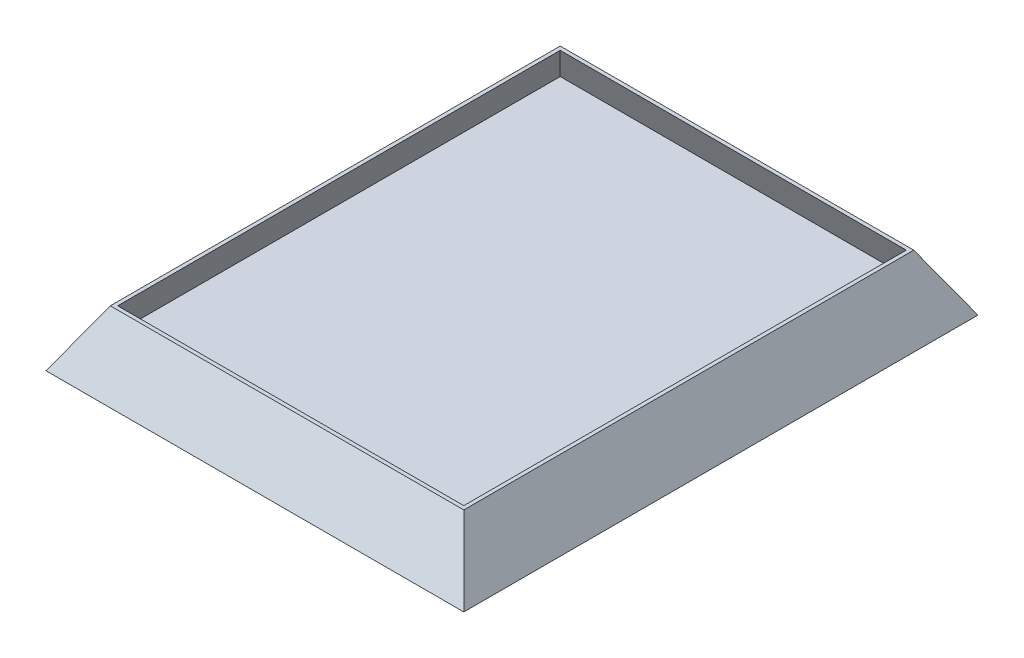
ISO-10303-21;
HEADER;
FILE_DESCRIPTION(('STEP AP214'),'2;1');
FILE_NAME('part.step','',(''),(''),'','','');
FILE_SCHEMA(('AUTOMOTIVE_DESIGN { 1 0 10303 214 1 1 1 1 }'));
ENDSEC;
DATA;
#1=APPLICATION_CONTEXT('core data for automotive mechanical design processes');
#2=APPLICATION_PROTOCOL_DEFINITION('international standard','automotive_design',2000,#1);
#3=PRODUCT_CONTEXT('',#1,'mechanical');
#4=PRODUCT('Part','Part','',(#3));
#5=PRODUCT_RELATED_PRODUCT_CATEGORY('part','',(#4));
#6=PRODUCT_DEFINITION_FORMATION('','',#4);
#7=PRODUCT_DEFINITION_CONTEXT('part definition',#1,'design');
#8=PRODUCT_DEFINITION('design','',#6,#7);
#9=PRODUCT_DEFINITION_SHAPE('','',#8);
#10=(LENGTH_UNIT() NAMED_UNIT(*) SI_UNIT(.MILLI.,.METRE.));
#11=(NAMED_UNIT(*) PLANE_ANGLE_UNIT() SI_UNIT($,.RADIAN.));
#12=(NAMED_UNIT(*) SI_UNIT($,.STERADIAN.) SOLID_ANGLE_UNIT());
#13=UNCERTAINTY_MEASURE_WITH_UNIT(LENGTH_MEASURE(1.E-05),#10,'distance_accuracy_value','');
#14=(GEOMETRIC_REPRESENTATION_CONTEXT(3) GLOBAL_UNCERTAINTY_ASSIGNED_CONTEXT((#13)) GLOBAL_UNIT_ASSIGNED_CONTEXT((#10,
#11,#12)) REPRESENTATION_CONTEXT('',''));
#15=CARTESIAN_POINT('',(0.,0.,0.));
#16=DIRECTION('',(0.,0.,1.));
#17=DIRECTION('',(1.,0.,0.));
#18=AXIS2_PLACEMENT_3D('',#15,#16,#17);
#19=CARTESIAN_POINT('',(0.,0.,0.));
#20=DIRECTION('',(0.,-1.,0.));
#21=DIRECTION('',(0.,0.,-1.));
#22=AXIS2_PLACEMENT_3D('',#19,#20,#21);
#23=PLANE('',#22);
#24=DIRECTION('',(0.,0.,-1.));
#25=VECTOR('',#24,1.);
#26=CARTESIAN_POINT('',(279.4,0.,355.6));
#27=LINE('',#26,#25);
#28=CARTESIAN_POINT('',(279.4,0.,355.6));
#29=VERTEX_POINT('',#28);
#30=CARTESIAN_POINT('',(279.4,0.,-355.6));
#31=VERTEX_POINT('',#30);
#32=EDGE_CURVE('E262',#29,#31,#27,.T.);
#33=ORIENTED_EDGE('',*,*,#32,.T.);
#34=DIRECTION('',(-1.,0.,0.));
#35=VECTOR('',#34,1.);
#36=CARTESIAN_POINT('',(-279.4,0.,-355.6));
#37=LINE('',#36,#35);
#38=CARTESIAN_POINT('',(-279.4,0.,-355.6));
#39=VERTEX_POINT('',#38);
#40=EDGE_CURVE('E296',#31,#39,#37,.T.);
#41=ORIENTED_EDGE('',*,*,#40,.T.);
#42=DIRECTION('',(0.,0.,1.));
#43=VECTOR('',#42,1.);
#44=CARTESIAN_POINT('',(-279.4,0.,355.6));
#45=LINE('',#44,#43);
#46=CARTESIAN_POINT('',(-279.4,0.,355.6));
#47=VERTEX_POINT('',#46);
#48=EDGE_CURVE('E60',#39,#47,#45,.T.);
#49=ORIENTED_EDGE('',*,*,#48,.T.);
#50=DIRECTION('',(1.,0.,0.));
#51=VECTOR('',#50,1.);
#52=CARTESIAN_POINT('',(-279.4,0.,355.6));
#53=LINE('',#52,#51);
#54=EDGE_CURVE('E12',#47,#29,#53,.T.);
#55=ORIENTED_EDGE('',*,*,#54,.T.);
#56=EDGE_LOOP('',(#33,#41,#49,#55));
#57=FACE_BOUND('',#56,.T.);
#58=DIRECTION('',(0.,0.,-1.));
#59=VECTOR('',#58,1.);
#60=CARTESIAN_POINT('',(273.549104376949,0.,0.));
#61=LINE('',#60,#59);
#62=CARTESIAN_POINT('',(273.549104376949,0.,349.749104376949));
#63=VERTEX_POINT('',#62);
#64=CARTESIAN_POINT('',(273.549104376949,0.,-349.749104376949));
#65=VERTEX_POINT('',#64);
#66=EDGE_CURVE('E143',#63,#65,#61,.T.);
#67=ORIENTED_EDGE('',*,*,#66,.F.);
#68=DIRECTION('',(1.,0.,0.));
#69=VECTOR('',#68,1.);
#70=CARTESIAN_POINT('',(0.,0.,349.749104376949));
#71=LINE('',#70,#69);
#72=CARTESIAN_POINT('',(-273.549104376949,0.,349.749104376949));
#73=VERTEX_POINT('',#72);
#74=EDGE_CURVE('E162',#73,#63,#71,.T.);
#75=ORIENTED_EDGE('',*,*,#74,.F.);
#76=DIRECTION('',(0.,0.,1.));
#77=VECTOR('',#76,1.);
#78=CARTESIAN_POINT('',(-273.549104376949,0.,0.));
#79=LINE('',#78,#77);
#80=CARTESIAN_POINT('',(-273.549104376949,0.,-349.749104376949));
#81=VERTEX_POINT('',#80);
#82=EDGE_CURVE('E68',#81,#73,#79,.T.);
#83=ORIENTED_EDGE('',*,*,#82,.F.);
#84=DIRECTION('',(-1.,0.,0.));
#85=VECTOR('',#84,1.);
#86=CARTESIAN_POINT('',(0.,0.,-349.749104376949));
#87=LINE('',#86,#85);
#88=EDGE_CURVE('E157',#65,#81,#87,.T.);
#89=ORIENTED_EDGE('',*,*,#88,.F.);
#90=EDGE_LOOP('',(#67,#75,#83,#89));
#91=FACE_BOUND('',#90,.T.);
#92=ADVANCED_FACE('F49',(#57,#91),#23,.F.);
#93=CARTESIAN_POINT('',(0.,-88.9,0.));
#94=DIRECTION('',(0.,-1.,0.));
#95=DIRECTION('',(0.,0.,-1.));
#96=AXIS2_PLACEMENT_3D('',#93,#94,#95);
#97=PLANE('',#96);
#98=DIRECTION('',(0.,0.,1.));
#99=VECTOR('',#98,1.);
#100=CARTESIAN_POINT('',(-330.2,-88.9,-406.4));
#101=LINE('',#100,#99);
#102=CARTESIAN_POINT('',(-330.2,-88.9,-406.4));
#103=VERTEX_POINT('',#102);
#104=CARTESIAN_POINT('',(-330.2,-88.9,406.4));
#105=VERTEX_POINT('',#104);
#106=EDGE_CURVE('E165',#103,#105,#101,.T.);
#107=ORIENTED_EDGE('',*,*,#106,.F.);
#108=DIRECTION('',(-1.,0.,0.));
#109=VECTOR('',#108,1.);
#110=CARTESIAN_POINT('',(330.2,-88.9,-406.4));
#111=LINE('',#110,#109);
#112=CARTESIAN_POINT('',(330.2,-88.9,-406.4));
#113=VERTEX_POINT('',#112);
#114=EDGE_CURVE('E173',#113,#103,#111,.T.);
#115=ORIENTED_EDGE('',*,*,#114,.F.);
#116=DIRECTION('',(0.,0.,-1.));
#117=VECTOR('',#116,1.);
#118=CARTESIAN_POINT('',(330.2,-88.9,-406.4));
#119=LINE('',#118,#117);
#120=CARTESIAN_POINT('',(330.2,-88.9,406.4));
#121=VERTEX_POINT('',#120);
#122=EDGE_CURVE('E269',#121,#113,#119,.T.);
#123=ORIENTED_EDGE('',*,*,#122,.F.);
#124=DIRECTION('',(1.,0.,0.));
#125=VECTOR('',#124,1.);
#126=CARTESIAN_POINT('',(330.2,-88.9,406.4));
#127=LINE('',#126,#125);
#128=EDGE_CURVE('E250',#105,#121,#127,.T.);
#129=ORIENTED_EDGE('',*,*,#128,.F.);
#130=EDGE_LOOP('',(#107,#115,#123,#129));
#131=FACE_BOUND('',#130,.T.);
#132=ADVANCED_FACE('F192',(#131),#97,.T.);
#133=CARTESIAN_POINT('',(0.,153.181538461538,-268.067692307692));
#134=DIRECTION('',(0.,-0.496138938356834,0.868243142124459));
#135=DIRECTION('',(0.,-0.868243142124459,-0.496138938356834));
#136=AXIS2_PLACEMENT_3D('',#133,#134,#135);
#137=PLANE('',#136);
#138=DIRECTION('',(0.444444444444447,0.777777777777777,0.444444444444444));
#139=VECTOR('',#138,1.);
#140=CARTESIAN_POINT('',(-330.2,-88.9,-406.4));
#141=LINE('',#140,#139);
#142=EDGE_CURVE('E432',#103,#39,#141,.T.);
#143=ORIENTED_EDGE('',*,*,#142,.T.);
#144=ORIENTED_EDGE('',*,*,#40,.F.);
#145=DIRECTION('',(-0.444444444444444,0.777777777777778,0.444444444444444));
#146=VECTOR('',#145,1.);
#147=CARTESIAN_POINT('',(330.2,-88.9,-406.4));
#148=LINE('',#147,#146);
#149=EDGE_CURVE('E179',#113,#31,#148,.T.);
#150=ORIENTED_EDGE('',*,*,#149,.F.);
#151=ORIENTED_EDGE('',*,*,#114,.T.);
#152=EDGE_LOOP('',(#143,#144,#150,#151));
#153=FACE_BOUND('',#152,.T.);
#154=ADVANCED_FACE('F181',(#153),#137,.F.);
#155=CARTESIAN_POINT('',(210.624615384615,120.356923076923,0.));
#156=DIRECTION('',(-0.868243142124459,-0.496138938356834,0.));
#157=DIRECTION('',(0.496138938356834,-0.868243142124459,0.));
#158=AXIS2_PLACEMENT_3D('',#155,#156,#157);
#159=PLANE('',#158);
#160=ORIENTED_EDGE('',*,*,#149,.T.);
#161=ORIENTED_EDGE('',*,*,#32,.F.);
#162=DIRECTION('',(-0.444444444444444,0.777777777777778,-0.444444444444444));
#163=VECTOR('',#162,1.);
#164=CARTESIAN_POINT('',(330.2,-88.9,406.4));
#165=LINE('',#164,#163);
#166=EDGE_CURVE('E242',#121,#29,#165,.T.);
#167=ORIENTED_EDGE('',*,*,#166,.F.);
#168=ORIENTED_EDGE('',*,*,#122,.T.);
#169=EDGE_LOOP('',(#160,#161,#167,#168));
#170=FACE_BOUND('',#169,.T.);
#171=ADVANCED_FACE('F191',(#170),#159,.F.);
#172=CARTESIAN_POINT('',(-210.624615384615,120.356923076923,0.));
#173=DIRECTION('',(0.868243142124458,-0.496138938356836,0.));
#174=DIRECTION('',(0.496138938356836,0.868243142124458,0.));
#175=AXIS2_PLACEMENT_3D('',#172,#173,#174);
#176=PLANE('',#175);
#177=DIRECTION('',(0.444444444444447,0.777777777777777,-0.444444444444444));
#178=VECTOR('',#177,1.);
#179=CARTESIAN_POINT('',(-330.2,-88.9,406.4));
#180=LINE('',#179,#178);
#181=EDGE_CURVE('E234',#105,#47,#180,.T.);
#182=ORIENTED_EDGE('',*,*,#181,.T.);
#183=ORIENTED_EDGE('',*,*,#48,.F.);
#184=ORIENTED_EDGE('',*,*,#142,.F.);
#185=ORIENTED_EDGE('',*,*,#106,.T.);
#186=EDGE_LOOP('',(#182,#183,#184,#185));
#187=FACE_BOUND('',#186,.T.);
#188=ADVANCED_FACE('F216',(#187),#176,.F.);
#189=CARTESIAN_POINT('',(0.,153.181538461538,268.067692307692));
#190=DIRECTION('',(0.,-0.496138938356834,-0.868243142124459));
#191=DIRECTION('',(0.,0.868243142124459,-0.496138938356834));
#192=AXIS2_PLACEMENT_3D('',#189,#190,#191);
#193=PLANE('',#192);
#194=ORIENTED_EDGE('',*,*,#166,.T.);
#195=ORIENTED_EDGE('',*,*,#54,.F.);
#196=ORIENTED_EDGE('',*,*,#181,.F.);
#197=ORIENTED_EDGE('',*,*,#128,.T.);
#198=EDGE_LOOP('',(#194,#195,#196,#197));
#199=FACE_BOUND('',#198,.T.);
#200=ADVANCED_FACE('F224',(#199),#193,.F.);
#201=CARTESIAN_POINT('',(0.,-83.82,0.));
#202=DIRECTION('',(0.,-1.,0.));
#203=DIRECTION('',(0.,0.,-1.));
#204=AXIS2_PLACEMENT_3D('',#201,#202,#203);
#205=PLANE('',#204);
#206=DIRECTION('',(0.,0.,1.));
#207=VECTOR('',#206,1.);
#208=CARTESIAN_POINT('',(-321.446247234092,-83.82,0.));
#209=LINE('',#208,#207);
#210=CARTESIAN_POINT('',(-321.446247234092,-83.82,-397.646247234092));
#211=VERTEX_POINT('',#210);
#212=CARTESIAN_POINT('',(-321.446247234092,-83.82,397.646247234092));
#213=VERTEX_POINT('',#212);
#214=EDGE_CURVE('E313',#211,#213,#209,.T.);
#215=ORIENTED_EDGE('',*,*,#214,.T.);
#216=DIRECTION('',(1.,0.,0.));
#217=VECTOR('',#216,1.);
#218=CARTESIAN_POINT('',(0.,-83.82,397.646247234092));
#219=LINE('',#218,#217);
#220=CARTESIAN_POINT('',(321.446247234092,-83.82,397.646247234092));
#221=VERTEX_POINT('',#220);
#222=EDGE_CURVE('E135',#213,#221,#219,.T.);
#223=ORIENTED_EDGE('',*,*,#222,.T.);
#224=DIRECTION('',(0.,0.,-1.));
#225=VECTOR('',#224,1.);
#226=CARTESIAN_POINT('',(321.446247234092,-83.82,0.));
#227=LINE('',#226,#225);
#228=CARTESIAN_POINT('',(321.446247234092,-83.82,-397.646247234092));
#229=VERTEX_POINT('',#228);
#230=EDGE_CURVE('E131',#221,#229,#227,.T.);
#231=ORIENTED_EDGE('',*,*,#230,.T.);
#232=DIRECTION('',(-1.,0.,0.));
#233=VECTOR('',#232,1.);
#234=CARTESIAN_POINT('',(0.,-83.82,-397.646247234092));
#235=LINE('',#234,#233);
#236=EDGE_CURVE('E119',#229,#211,#235,.T.);
#237=ORIENTED_EDGE('',*,*,#236,.T.);
#238=EDGE_LOOP('',(#215,#223,#231,#237));
#239=FACE_BOUND('',#238,.T.);
#240=ADVANCED_FACE('F134',(#239),#205,.F.);
#241=CARTESIAN_POINT('',(0.,150.661152654686,-263.6570171457));
#242=DIRECTION('',(0.,-0.496138938356834,0.868243142124459));
#243=DIRECTION('',(0.,-0.868243142124459,-0.496138938356834));
#244=AXIS2_PLACEMENT_3D('',#241,#242,#243);
#245=PLANE('',#244);
#246=DIRECTION('',(0.444444444444446,0.777777777777777,0.444444444444444));
#247=VECTOR('',#246,1.);
#248=CARTESIAN_POINT('',(-150.428470549018,215.461109198878,-226.628470549019));
#249=LINE('',#248,#247);
#250=EDGE_CURVE('E126',#211,#81,#249,.T.);
#251=ORIENTED_EDGE('',*,*,#250,.F.);
#252=ORIENTED_EDGE('',*,*,#236,.F.);
#253=DIRECTION('',(-0.444444444444445,0.777777777777778,0.444444444444445));
#254=VECTOR('',#253,1.);
#255=CARTESIAN_POINT('',(150.428470549019,215.461109198878,-226.628470549019));
#256=LINE('',#255,#254);
#257=EDGE_CURVE('E124',#229,#65,#256,.T.);
#258=ORIENTED_EDGE('',*,*,#257,.T.);
#259=ORIENTED_EDGE('',*,*,#88,.T.);
#260=EDGE_LOOP('',(#251,#252,#258,#259));
#261=FACE_BOUND('',#260,.T.);
#262=ADVANCED_FACE('F121',(#261),#245,.T.);
#263=CARTESIAN_POINT('',(206.213940222623,117.83653727007,0.));
#264=DIRECTION('',(-0.868243142124459,-0.496138938356834,0.));
#265=DIRECTION('',(0.496138938356834,-0.868243142124459,0.));
#266=AXIS2_PLACEMENT_3D('',#263,#264,#265);
#267=PLANE('',#266);
#268=ORIENTED_EDGE('',*,*,#257,.F.);
#269=ORIENTED_EDGE('',*,*,#230,.F.);
#270=DIRECTION('',(-0.444444444444445,0.777777777777778,-0.444444444444445));
#271=VECTOR('',#270,1.);
#272=CARTESIAN_POINT('',(150.428470549019,215.461109198878,226.628470549018));
#273=LINE('',#272,#271);
#274=EDGE_CURVE('E150',#221,#63,#273,.T.);
#275=ORIENTED_EDGE('',*,*,#274,.T.);
#276=ORIENTED_EDGE('',*,*,#66,.T.);
#277=EDGE_LOOP('',(#268,#269,#275,#276));
#278=FACE_BOUND('',#277,.T.);
#279=ADVANCED_FACE('F141',(#278),#267,.T.);
#280=CARTESIAN_POINT('',(-206.213940222622,117.836537270071,0.));
#281=DIRECTION('',(0.868243142124458,-0.496138938356836,0.));
#282=DIRECTION('',(0.496138938356836,0.868243142124458,0.));
#283=AXIS2_PLACEMENT_3D('',#280,#281,#282);
#284=PLANE('',#283);
#285=DIRECTION('',(0.444444444444446,0.777777777777777,-0.444444444444444));
#286=VECTOR('',#285,1.);
#287=CARTESIAN_POINT('',(-150.428470549018,215.461109198878,226.628470549018));
#288=LINE('',#287,#286);
#289=EDGE_CURVE('E146',#213,#73,#288,.T.);
#290=ORIENTED_EDGE('',*,*,#289,.F.);
#291=ORIENTED_EDGE('',*,*,#214,.F.);
#292=ORIENTED_EDGE('',*,*,#250,.T.);
#293=ORIENTED_EDGE('',*,*,#82,.T.);
#294=EDGE_LOOP('',(#290,#291,#292,#293));
#295=FACE_BOUND('',#294,.T.);
#296=ADVANCED_FACE('F312',(#295),#284,.T.);
#297=CARTESIAN_POINT('',(0.,150.661152654686,263.6570171457));
#298=DIRECTION('',(0.,-0.496138938356834,-0.868243142124459));
#299=DIRECTION('',(0.,0.868243142124459,-0.496138938356834));
#300=AXIS2_PLACEMENT_3D('',#297,#298,#299);
#301=PLANE('',#300);
#302=ORIENTED_EDGE('',*,*,#274,.F.);
#303=ORIENTED_EDGE('',*,*,#222,.F.);
#304=ORIENTED_EDGE('',*,*,#289,.T.);
#305=ORIENTED_EDGE('',*,*,#74,.T.);
#306=EDGE_LOOP('',(#302,#303,#304,#305));
#307=FACE_BOUND('',#306,.T.);
#308=ADVANCED_FACE('F311',(#307),#301,.T.);
#309=CLOSED_SHELL('',(#92,#132,#154,#171,#188,#200,#240,#262,#279,#296,#308));
#310=MANIFOLD_SOLID_BREP('B2',#309);
#311=ADVANCED_BREP_SHAPE_REPRESENTATION('',(#18,#310),#14);
#312=SHAPE_DEFINITION_REPRESENTATION(#9,#311);
ENDSEC;
END-ISO-10303-21;
